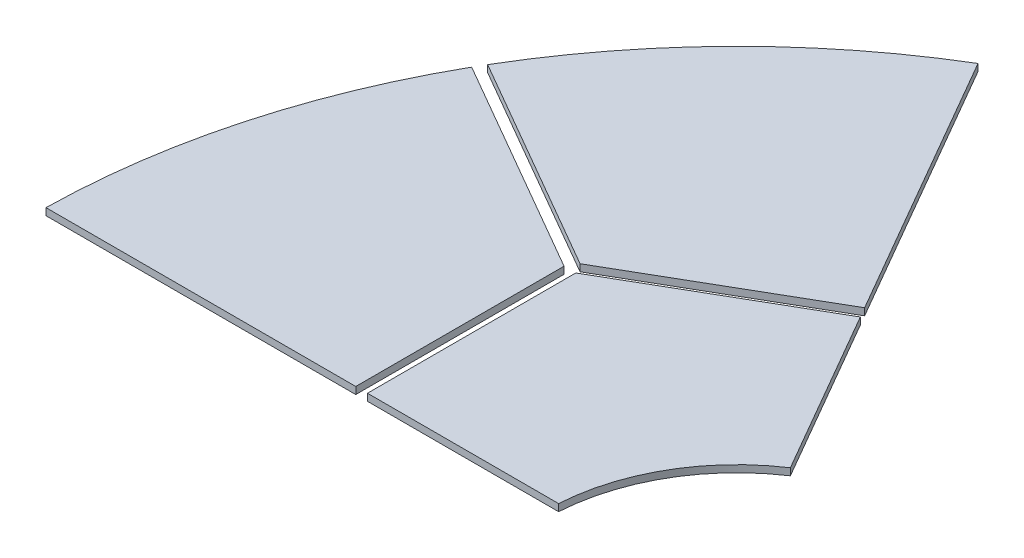
ISO-10303-21;
HEADER;
FILE_DESCRIPTION(('STEP AP214'),'2;1');
FILE_NAME('part.step','',(''),(''),'','','');
FILE_SCHEMA(('AUTOMOTIVE_DESIGN { 1 0 10303 214 1 1 1 1 }'));
ENDSEC;
DATA;
#1=APPLICATION_CONTEXT('core data for automotive mechanical design processes');
#2=APPLICATION_PROTOCOL_DEFINITION('international standard','automotive_design',2000,#1);
#3=PRODUCT_CONTEXT('',#1,'mechanical');
#4=PRODUCT('Part','Part','',(#3));
#5=PRODUCT_RELATED_PRODUCT_CATEGORY('part','',(#4));
#6=PRODUCT_DEFINITION_FORMATION('','',#4);
#7=PRODUCT_DEFINITION_CONTEXT('part definition',#1,'design');
#8=PRODUCT_DEFINITION('design','',#6,#7);
#9=PRODUCT_DEFINITION_SHAPE('','',#8);
#10=(LENGTH_UNIT() NAMED_UNIT(*) SI_UNIT(.MILLI.,.METRE.));
#11=(NAMED_UNIT(*) PLANE_ANGLE_UNIT() SI_UNIT($,.RADIAN.));
#12=(NAMED_UNIT(*) SI_UNIT($,.STERADIAN.) SOLID_ANGLE_UNIT());
#13=UNCERTAINTY_MEASURE_WITH_UNIT(LENGTH_MEASURE(1.E-05),#10,'distance_accuracy_value','');
#14=(GEOMETRIC_REPRESENTATION_CONTEXT(3) GLOBAL_UNCERTAINTY_ASSIGNED_CONTEXT((#13)) GLOBAL_UNIT_ASSIGNED_CONTEXT((#10,
#11,#12)) REPRESENTATION_CONTEXT('',''));
#15=CARTESIAN_POINT('',(0.,0.,0.));
#16=DIRECTION('',(0.,0.,1.));
#17=DIRECTION('',(1.,0.,0.));
#18=AXIS2_PLACEMENT_3D('',#15,#16,#17);
#19=CARTESIAN_POINT('',(0.,6.,0.));
#20=DIRECTION('',(0.,-1.,0.));
#21=DIRECTION('',(0.,0.,-1.));
#22=AXIS2_PLACEMENT_3D('',#19,#20,#21);
#23=CYLINDRICAL_SURFACE('',#22,162.4);
#24=CARTESIAN_POINT('',(0.,0.,0.));
#25=DIRECTION('',(0.,1.,0.));
#26=DIRECTION('',(0.,0.,1.));
#27=AXIS2_PLACEMENT_3D('',#24,#25,#26);
#28=CIRCLE('',#27,162.4);
#29=CARTESIAN_POINT('',(-89.7061669514525,0.,-135.37563891217));
#30=VERTEX_POINT('',#29);
#31=CARTESIAN_POINT('',(-162.091825827214,0.,-10.));
#32=VERTEX_POINT('',#31);
#33=EDGE_CURVE('E179',#30,#32,#28,.T.);
#34=ORIENTED_EDGE('',*,*,#33,.F.);
#35=DIRECTION('',(0.,-1.,0.));
#36=VECTOR('',#35,1.);
#37=CARTESIAN_POINT('',(-89.7061669514525,6.,-135.37563891217));
#38=LINE('',#37,#36);
#39=CARTESIAN_POINT('',(-89.7061669514525,6.,-135.37563891217));
#40=VERTEX_POINT('',#39);
#41=EDGE_CURVE('E13',#40,#30,#38,.T.);
#42=ORIENTED_EDGE('',*,*,#41,.F.);
#43=CARTESIAN_POINT('',(0.,6.,0.));
#44=DIRECTION('',(0.,1.,0.));
#45=DIRECTION('',(0.,0.,1.));
#46=AXIS2_PLACEMENT_3D('',#43,#44,#45);
#47=CIRCLE('',#46,162.4);
#48=CARTESIAN_POINT('',(-162.091825827214,6.,-10.));
#49=VERTEX_POINT('',#48);
#50=EDGE_CURVE('E190',#40,#49,#47,.T.);
#51=ORIENTED_EDGE('',*,*,#50,.T.);
#52=DIRECTION('',(0.,-1.,0.));
#53=VECTOR('',#52,1.);
#54=CARTESIAN_POINT('',(-162.091825827214,6.,-10.));
#55=LINE('',#54,#53);
#56=EDGE_CURVE('E122',#49,#32,#55,.T.);
#57=ORIENTED_EDGE('',*,*,#56,.T.);
#58=EDGE_LOOP('',(#34,#42,#51,#57));
#59=FACE_BOUND('',#58,.T.);
#60=ADVANCED_FACE('F106',(#59),#23,.F.);
#61=CARTESIAN_POINT('',(-8.66025403784625,6.,5.000000000001));
#62=DIRECTION('',(-0.866025403784442,0.,0.499999999999994));
#63=DIRECTION('',(0.499999999999994,0.,0.866025403784442));
#64=AXIS2_PLACEMENT_3D('',#61,#62,#63);
#65=PLANE('',#64);
#66=DIRECTION('',(-0.499999999999994,0.,-0.866025403784442));
#67=VECTOR('',#66,1.);
#68=CARTESIAN_POINT('',(-8.66025403784625,0.,5.000000000001));
#69=LINE('',#68,#67);
#70=CARTESIAN_POINT('',(-171.260254037845,0.,-276.6314613107));
#71=VERTEX_POINT('',#70);
#72=EDGE_CURVE('E181',#30,#71,#69,.T.);
#73=ORIENTED_EDGE('',*,*,#72,.T.);
#74=DIRECTION('',(0.,-1.,0.));
#75=VECTOR('',#74,1.);
#76=CARTESIAN_POINT('',(-171.260254037845,6.,-276.6314613107));
#77=LINE('',#76,#75);
#78=CARTESIAN_POINT('',(-171.260254037845,6.,-276.6314613107));
#79=VERTEX_POINT('',#78);
#80=EDGE_CURVE('E114',#79,#71,#77,.T.);
#81=ORIENTED_EDGE('',*,*,#80,.F.);
#82=DIRECTION('',(-0.499999999999994,0.,-0.866025403784442));
#83=VECTOR('',#82,1.);
#84=CARTESIAN_POINT('',(-8.66025403784625,6.,5.000000000001));
#85=LINE('',#84,#83);
#86=EDGE_CURVE('E170',#40,#79,#85,.T.);
#87=ORIENTED_EDGE('',*,*,#86,.F.);
#88=ORIENTED_EDGE('',*,*,#41,.T.);
#89=EDGE_LOOP('',(#73,#81,#87,#88));
#90=FACE_BOUND('',#89,.T.);
#91=ADVANCED_FACE('F194',(#90),#65,.F.);
#92=CARTESIAN_POINT('',(-162.6,6.,-281.6314613107));
#93=DIRECTION('',(-0.5,0.,-0.866025403784438));
#94=DIRECTION('',(-0.866025403784439,0.,0.5));
#95=AXIS2_PLACEMENT_3D('',#92,#93,#94);
#96=PLANE('',#95);
#97=DIRECTION('',(0.866025403784439,0.,-0.5));
#98=VECTOR('',#97,1.);
#99=CARTESIAN_POINT('',(-162.6,0.,-281.6314613107));
#100=LINE('',#99,#98);
#101=CARTESIAN_POINT('',(-325.2,0.,-187.754307540467));
#102=VERTEX_POINT('',#101);
#103=EDGE_CURVE('E159',#102,#71,#100,.T.);
#104=ORIENTED_EDGE('',*,*,#103,.F.);
#105=DIRECTION('',(0.,-1.,0.));
#106=VECTOR('',#105,1.);
#107=CARTESIAN_POINT('',(-325.2,6.,-187.754307540467));
#108=LINE('',#107,#106);
#109=CARTESIAN_POINT('',(-325.2,6.,-187.754307540467));
#110=VERTEX_POINT('',#109);
#111=EDGE_CURVE('E154',#110,#102,#108,.T.);
#112=ORIENTED_EDGE('',*,*,#111,.F.);
#113=DIRECTION('',(0.866025403784439,0.,-0.5));
#114=VECTOR('',#113,1.);
#115=CARTESIAN_POINT('',(-162.6,6.,-281.6314613107));
#116=LINE('',#115,#114);
#117=EDGE_CURVE('E157',#110,#79,#116,.T.);
#118=ORIENTED_EDGE('',*,*,#117,.T.);
#119=ORIENTED_EDGE('',*,*,#80,.T.);
#120=EDGE_LOOP('',(#104,#112,#118,#119));
#121=FACE_BOUND('',#120,.T.);
#122=ADVANCED_FACE('F156',(#121),#96,.T.);
#123=CARTESIAN_POINT('',(-325.2,6.,0.));
#124=DIRECTION('',(-1.,0.,0.));
#125=DIRECTION('',(0.,0.,1.));
#126=AXIS2_PLACEMENT_3D('',#123,#124,#125);
#127=PLANE('',#126);
#128=DIRECTION('',(0.,0.,-1.));
#129=VECTOR('',#128,1.);
#130=CARTESIAN_POINT('',(-325.2,0.,0.));
#131=LINE('',#130,#129);
#132=CARTESIAN_POINT('',(-325.2,0.,-10.));
#133=VERTEX_POINT('',#132);
#134=EDGE_CURVE('E185',#133,#102,#131,.T.);
#135=ORIENTED_EDGE('',*,*,#134,.F.);
#136=DIRECTION('',(0.,-1.,0.));
#137=VECTOR('',#136,1.);
#138=CARTESIAN_POINT('',(-325.2,6.,-10.));
#139=LINE('',#138,#137);
#140=CARTESIAN_POINT('',(-325.2,6.,-10.));
#141=VERTEX_POINT('',#140);
#142=EDGE_CURVE('E138',#141,#133,#139,.T.);
#143=ORIENTED_EDGE('',*,*,#142,.F.);
#144=DIRECTION('',(0.,0.,-1.));
#145=VECTOR('',#144,1.);
#146=CARTESIAN_POINT('',(-325.2,6.,0.));
#147=LINE('',#146,#145);
#148=EDGE_CURVE('E169',#141,#110,#147,.T.);
#149=ORIENTED_EDGE('',*,*,#148,.T.);
#150=ORIENTED_EDGE('',*,*,#111,.T.);
#151=EDGE_LOOP('',(#135,#143,#149,#150));
#152=FACE_BOUND('',#151,.T.);
#153=ADVANCED_FACE('F173',(#152),#127,.T.);
#154=CARTESIAN_POINT('',(0.,6.,-10.));
#155=DIRECTION('',(0.,0.,1.));
#156=DIRECTION('',(1.,0.,0.));
#157=AXIS2_PLACEMENT_3D('',#154,#155,#156);
#158=PLANE('',#157);
#159=DIRECTION('',(-1.,0.,0.));
#160=VECTOR('',#159,1.);
#161=CARTESIAN_POINT('',(0.,0.,-10.));
#162=LINE('',#161,#160);
#163=EDGE_CURVE('E187',#32,#133,#162,.T.);
#164=ORIENTED_EDGE('',*,*,#163,.F.);
#165=ORIENTED_EDGE('',*,*,#56,.F.);
#166=DIRECTION('',(-1.,0.,0.));
#167=VECTOR('',#166,1.);
#168=CARTESIAN_POINT('',(0.,6.,-10.));
#169=LINE('',#168,#167);
#170=EDGE_CURVE('E174',#49,#141,#169,.T.);
#171=ORIENTED_EDGE('',*,*,#170,.T.);
#172=ORIENTED_EDGE('',*,*,#142,.T.);
#173=EDGE_LOOP('',(#164,#165,#171,#172));
#174=FACE_BOUND('',#173,.T.);
#175=ADVANCED_FACE('F197',(#174),#158,.T.);
#176=CARTESIAN_POINT('',(0.,6.,0.));
#177=DIRECTION('',(0.,1.,0.));
#178=DIRECTION('',(0.,0.,1.));
#179=AXIS2_PLACEMENT_3D('',#176,#177,#178);
#180=PLANE('',#179);
#181=ORIENTED_EDGE('',*,*,#50,.F.);
#182=ORIENTED_EDGE('',*,*,#86,.T.);
#183=ORIENTED_EDGE('',*,*,#117,.F.);
#184=ORIENTED_EDGE('',*,*,#148,.F.);
#185=ORIENTED_EDGE('',*,*,#170,.F.);
#186=EDGE_LOOP('',(#181,#182,#183,#184,#185));
#187=FACE_BOUND('',#186,.T.);
#188=ADVANCED_FACE('F167',(#187),#180,.T.);
#189=CARTESIAN_POINT('',(0.,0.,0.));
#190=DIRECTION('',(0.,1.,0.));
#191=DIRECTION('',(0.,0.,1.));
#192=AXIS2_PLACEMENT_3D('',#189,#190,#191);
#193=PLANE('',#192);
#194=ORIENTED_EDGE('',*,*,#33,.T.);
#195=ORIENTED_EDGE('',*,*,#163,.T.);
#196=ORIENTED_EDGE('',*,*,#134,.T.);
#197=ORIENTED_EDGE('',*,*,#103,.T.);
#198=ORIENTED_EDGE('',*,*,#72,.F.);
#199=EDGE_LOOP('',(#194,#195,#196,#197,#198));
#200=FACE_BOUND('',#199,.T.);
#201=ADVANCED_FACE('F196',(#200),#193,.F.);
#202=CLOSED_SHELL('',(#60,#91,#122,#153,#175,#188,#201));
#203=MANIFOLD_SOLID_BREP('B2',#202);
#204=CARTESIAN_POINT('',(1.11022302462516E-13,6.,0.));
#205=DIRECTION('',(0.,-1.,0.));
#206=DIRECTION('',(0.,0.,-1.));
#207=AXIS2_PLACEMENT_3D('',#204,#205,#206);
#208=CYLINDRICAL_SURFACE('',#207,599.6);
#209=CARTESIAN_POINT('',(1.11022302462516E-13,0.,0.));
#210=DIRECTION('',(0.,1.,0.));
#211=DIRECTION('',(0.,0.,1.));
#212=AXIS2_PLACEMENT_3D('',#209,#210,#211);
#213=CIRCLE('',#212,599.6);
#214=CARTESIAN_POINT('',(-516.750777563212,0.,-304.119703221965));
#215=VERTEX_POINT('',#214);
#216=CARTESIAN_POINT('',(-308.418556675151,0.,-514.196610158426));
#217=VERTEX_POINT('',#216);
#218=EDGE_CURVE('E362',#215,#217,#213,.F.);
#219=ORIENTED_EDGE('',*,*,#218,.F.);
#220=DIRECTION('',(0.,-1.,0.));
#221=VECTOR('',#220,1.);
#222=CARTESIAN_POINT('',(-516.750777563212,6.,-304.119703221965));
#223=LINE('',#222,#221);
#224=CARTESIAN_POINT('',(-516.750777563212,6.,-304.119703221965));
#225=VERTEX_POINT('',#224);
#226=EDGE_CURVE('E104',#225,#215,#223,.T.);
#227=ORIENTED_EDGE('',*,*,#226,.F.);
#228=CARTESIAN_POINT('',(1.11022302462516E-13,6.,0.));
#229=DIRECTION('',(0.,1.,0.));
#230=DIRECTION('',(0.,0.,1.));
#231=AXIS2_PLACEMENT_3D('',#228,#229,#230);
#232=CIRCLE('',#231,599.6);
#233=CARTESIAN_POINT('',(-308.418556675151,6.,-514.196610158426));
#234=VERTEX_POINT('',#233);
#235=EDGE_CURVE('E353',#225,#234,#232,.F.);
#236=ORIENTED_EDGE('',*,*,#235,.T.);
#237=DIRECTION('',(0.,-1.,0.));
#238=VECTOR('',#237,1.);
#239=CARTESIAN_POINT('',(-308.418556675151,6.,-514.196610158426));
#240=LINE('',#239,#238);
#241=EDGE_CURVE('E332',#234,#217,#240,.T.);
#242=ORIENTED_EDGE('',*,*,#241,.T.);
#243=EDGE_LOOP('',(#219,#227,#236,#242));
#244=FACE_BOUND('',#243,.T.);
#245=ADVANCED_FACE('F293',(#244),#208,.T.);
#246=CARTESIAN_POINT('',(2.49999999999996,6.,-4.33012701892212));
#247=DIRECTION('',(-0.5,0.,0.866025403784438));
#248=DIRECTION('',(0.866025403784439,0.,0.5));
#249=AXIS2_PLACEMENT_3D('',#246,#247,#248);
#250=PLANE('',#249);
#251=DIRECTION('',(-0.866025403784439,0.,-0.5));
#252=VECTOR('',#251,1.);
#253=CARTESIAN_POINT('',(2.49999999999996,0.,-4.33012701892212));
#254=LINE('',#253,#252);
#255=CARTESIAN_POINT('',(-330.200000000001,0.,-196.414561578311));
#256=VERTEX_POINT('',#255);
#257=EDGE_CURVE('E345',#256,#215,#254,.T.);
#258=ORIENTED_EDGE('',*,*,#257,.F.);
#259=DIRECTION('',(0.,-1.,0.));
#260=VECTOR('',#259,1.);
#261=CARTESIAN_POINT('',(-330.200000000001,6.,-196.414561578311));
#262=LINE('',#261,#260);
#263=CARTESIAN_POINT('',(-330.200000000001,6.,-196.414561578311));
#264=VERTEX_POINT('',#263);
#265=EDGE_CURVE('E302',#264,#256,#262,.T.);
#266=ORIENTED_EDGE('',*,*,#265,.F.);
#267=DIRECTION('',(-0.866025403784439,0.,-0.5));
#268=VECTOR('',#267,1.);
#269=CARTESIAN_POINT('',(2.49999999999996,6.,-4.33012701892212));
#270=LINE('',#269,#268);
#271=EDGE_CURVE('E343',#264,#225,#270,.T.);
#272=ORIENTED_EDGE('',*,*,#271,.T.);
#273=ORIENTED_EDGE('',*,*,#226,.T.);
#274=EDGE_LOOP('',(#258,#266,#272,#273));
#275=FACE_BOUND('',#274,.T.);
#276=ADVANCED_FACE('F341',(#275),#250,.T.);
#277=CARTESIAN_POINT('',(-167.6,6.,-290.291715348544));
#278=DIRECTION('',(-0.5,0.,-0.866025403784438));
#279=DIRECTION('',(-0.866025403784439,0.,0.5));
#280=AXIS2_PLACEMENT_3D('',#277,#278,#279);
#281=PLANE('',#280);
#282=DIRECTION('',(0.866025403784438,0.,-0.5));
#283=VECTOR('',#282,1.);
#284=CARTESIAN_POINT('',(-167.6,0.,-290.291715348544));
#285=LINE('',#284,#283);
#286=CARTESIAN_POINT('',(-176.260254037845,0.,-285.291715348544));
#287=VERTEX_POINT('',#286);
#288=EDGE_CURVE('E325',#256,#287,#285,.T.);
#289=ORIENTED_EDGE('',*,*,#288,.T.);
#290=DIRECTION('',(0.,-1.,0.));
#291=VECTOR('',#290,1.);
#292=CARTESIAN_POINT('',(-176.260254037845,6.,-285.291715348544));
#293=LINE('',#292,#291);
#294=CARTESIAN_POINT('',(-176.260254037845,6.,-285.291715348544));
#295=VERTEX_POINT('',#294);
#296=EDGE_CURVE('E347',#295,#287,#293,.T.);
#297=ORIENTED_EDGE('',*,*,#296,.F.);
#298=DIRECTION('',(0.866025403784438,0.,-0.5));
#299=VECTOR('',#298,1.);
#300=CARTESIAN_POINT('',(-167.6,6.,-290.291715348544));
#301=LINE('',#300,#299);
#302=EDGE_CURVE('E348',#264,#295,#301,.T.);
#303=ORIENTED_EDGE('',*,*,#302,.F.);
#304=ORIENTED_EDGE('',*,*,#265,.T.);
#305=EDGE_LOOP('',(#289,#297,#303,#304));
#306=FACE_BOUND('',#305,.T.);
#307=ADVANCED_FACE('F349',(#306),#281,.F.);
#308=CARTESIAN_POINT('',(-8.6602540378462,6.,5.00000000000098));
#309=DIRECTION('',(-0.866025403784442,0.,0.499999999999995));
#310=DIRECTION('',(0.499999999999995,0.,0.866025403784442));
#311=AXIS2_PLACEMENT_3D('',#308,#309,#310);
#312=PLANE('',#311);
#313=DIRECTION('',(-0.499999999999995,0.,-0.866025403784442));
#314=VECTOR('',#313,1.);
#315=CARTESIAN_POINT('',(-8.6602540378462,0.,5.00000000000098));
#316=LINE('',#315,#314);
#317=EDGE_CURVE('E357',#287,#217,#316,.T.);
#318=ORIENTED_EDGE('',*,*,#317,.T.);
#319=ORIENTED_EDGE('',*,*,#241,.F.);
#320=DIRECTION('',(-0.499999999999995,0.,-0.866025403784442));
#321=VECTOR('',#320,1.);
#322=CARTESIAN_POINT('',(-8.6602540378462,6.,5.00000000000098));
#323=LINE('',#322,#321);
#324=EDGE_CURVE('E310',#295,#234,#323,.T.);
#325=ORIENTED_EDGE('',*,*,#324,.F.);
#326=ORIENTED_EDGE('',*,*,#296,.T.);
#327=EDGE_LOOP('',(#318,#319,#325,#326));
#328=FACE_BOUND('',#327,.T.);
#329=ADVANCED_FACE('F377',(#328),#312,.F.);
#330=CARTESIAN_POINT('',(0.,6.,0.));
#331=DIRECTION('',(0.,1.,0.));
#332=DIRECTION('',(0.,0.,1.));
#333=AXIS2_PLACEMENT_3D('',#330,#331,#332);
#334=PLANE('',#333);
#335=ORIENTED_EDGE('',*,*,#235,.F.);
#336=ORIENTED_EDGE('',*,*,#271,.F.);
#337=ORIENTED_EDGE('',*,*,#302,.T.);
#338=ORIENTED_EDGE('',*,*,#324,.T.);
#339=EDGE_LOOP('',(#335,#336,#337,#338));
#340=FACE_BOUND('',#339,.T.);
#341=ADVANCED_FACE('F352',(#340),#334,.T.);
#342=CARTESIAN_POINT('',(0.,0.,0.));
#343=DIRECTION('',(0.,1.,0.));
#344=DIRECTION('',(0.,0.,1.));
#345=AXIS2_PLACEMENT_3D('',#342,#343,#344);
#346=PLANE('',#345);
#347=ORIENTED_EDGE('',*,*,#218,.T.);
#348=ORIENTED_EDGE('',*,*,#317,.F.);
#349=ORIENTED_EDGE('',*,*,#288,.F.);
#350=ORIENTED_EDGE('',*,*,#257,.T.);
#351=EDGE_LOOP('',(#347,#348,#349,#350));
#352=FACE_BOUND('',#351,.T.);
#353=ADVANCED_FACE('F379',(#352),#346,.F.);
#354=CLOSED_SHELL('',(#245,#276,#307,#329,#341,#353));
#355=MANIFOLD_SOLID_BREP('B7',#354);
#356=CARTESIAN_POINT('',(1.11022302462516E-13,6.,0.));
#357=DIRECTION('',(0.,-1.,0.));
#358=DIRECTION('',(0.,0.,-1.));
#359=AXIS2_PLACEMENT_3D('',#356,#357,#358);
#360=CYLINDRICAL_SURFACE('',#359,599.6);
#361=CARTESIAN_POINT('',(1.11022302462516E-13,0.,0.));
#362=DIRECTION('',(0.,1.,0.));
#363=DIRECTION('',(0.,0.,1.));
#364=AXIS2_PLACEMENT_3D('',#361,#362,#363);
#365=CIRCLE('',#364,599.6);
#366=CARTESIAN_POINT('',(-599.516605274616,0.,-10.));
#367=VERTEX_POINT('',#366);
#368=CARTESIAN_POINT('',(-521.750777563212,0.,-295.459449184121));
#369=VERTEX_POINT('',#368);
#370=EDGE_CURVE('E515',#367,#369,#365,.F.);
#371=ORIENTED_EDGE('',*,*,#370,.F.);
#372=DIRECTION('',(0.,-1.,0.));
#373=VECTOR('',#372,1.);
#374=CARTESIAN_POINT('',(-599.516605274616,6.,-10.));
#375=LINE('',#374,#373);
#376=CARTESIAN_POINT('',(-599.516605274616,6.,-10.));
#377=VERTEX_POINT('',#376);
#378=EDGE_CURVE('E291',#377,#367,#375,.T.);
#379=ORIENTED_EDGE('',*,*,#378,.F.);
#380=CARTESIAN_POINT('',(1.11022302462516E-13,6.,0.));
#381=DIRECTION('',(0.,1.,0.));
#382=DIRECTION('',(0.,0.,1.));
#383=AXIS2_PLACEMENT_3D('',#380,#381,#382);
#384=CIRCLE('',#383,599.6);
#385=CARTESIAN_POINT('',(-521.750777563212,6.,-295.459449184121));
#386=VERTEX_POINT('',#385);
#387=EDGE_CURVE('E509',#377,#386,#384,.F.);
#388=ORIENTED_EDGE('',*,*,#387,.T.);
#389=DIRECTION('',(0.,-1.,0.));
#390=VECTOR('',#389,1.);
#391=CARTESIAN_POINT('',(-521.750777563212,6.,-295.459449184121));
#392=LINE('',#391,#390);
#393=EDGE_CURVE('E490',#386,#369,#392,.T.);
#394=ORIENTED_EDGE('',*,*,#393,.T.);
#395=EDGE_LOOP('',(#371,#379,#388,#394));
#396=FACE_BOUND('',#395,.T.);
#397=ADVANCED_FACE('F452',(#396),#360,.T.);
#398=CARTESIAN_POINT('',(0.,6.,-10.));
#399=DIRECTION('',(0.,0.,1.));
#400=DIRECTION('',(1.,0.,0.));
#401=AXIS2_PLACEMENT_3D('',#398,#399,#400);
#402=PLANE('',#401);
#403=DIRECTION('',(-1.,0.,0.));
#404=VECTOR('',#403,1.);
#405=CARTESIAN_POINT('',(0.,0.,-10.));
#406=LINE('',#405,#404);
#407=CARTESIAN_POINT('',(-335.2,0.,-10.));
#408=VERTEX_POINT('',#407);
#409=EDGE_CURVE('E503',#408,#367,#406,.T.);
#410=ORIENTED_EDGE('',*,*,#409,.F.);
#411=DIRECTION('',(0.,-1.,0.));
#412=VECTOR('',#411,1.);
#413=CARTESIAN_POINT('',(-335.2,6.,-10.));
#414=LINE('',#413,#412);
#415=CARTESIAN_POINT('',(-335.2,6.,-10.));
#416=VERTEX_POINT('',#415);
#417=EDGE_CURVE('E460',#416,#408,#414,.T.);
#418=ORIENTED_EDGE('',*,*,#417,.F.);
#419=DIRECTION('',(-1.,0.,0.));
#420=VECTOR('',#419,1.);
#421=CARTESIAN_POINT('',(0.,6.,-10.));
#422=LINE('',#421,#420);
#423=EDGE_CURVE('E501',#416,#377,#422,.T.);
#424=ORIENTED_EDGE('',*,*,#423,.T.);
#425=ORIENTED_EDGE('',*,*,#378,.T.);
#426=EDGE_LOOP('',(#410,#418,#424,#425));
#427=FACE_BOUND('',#426,.T.);
#428=ADVANCED_FACE('F499',(#427),#402,.T.);
#429=CARTESIAN_POINT('',(-335.2,6.,0.));
#430=DIRECTION('',(-1.,0.,0.));
#431=DIRECTION('',(0.,0.,1.));
#432=AXIS2_PLACEMENT_3D('',#429,#430,#431);
#433=PLANE('',#432);
#434=DIRECTION('',(0.,0.,-1.));
#435=VECTOR('',#434,1.);
#436=CARTESIAN_POINT('',(-335.2,0.,0.));
#437=LINE('',#436,#435);
#438=CARTESIAN_POINT('',(-335.2,0.,-187.754307540466));
#439=VERTEX_POINT('',#438);
#440=EDGE_CURVE('E483',#408,#439,#437,.T.);
#441=ORIENTED_EDGE('',*,*,#440,.T.);
#442=DIRECTION('',(0.,-1.,0.));
#443=VECTOR('',#442,1.);
#444=CARTESIAN_POINT('',(-335.2,6.,-187.754307540466));
#445=LINE('',#444,#443);
#446=CARTESIAN_POINT('',(-335.2,6.,-187.754307540466));
#447=VERTEX_POINT('',#446);
#448=EDGE_CURVE('E504',#447,#439,#445,.T.);
#449=ORIENTED_EDGE('',*,*,#448,.F.);
#450=DIRECTION('',(0.,0.,-1.));
#451=VECTOR('',#450,1.);
#452=CARTESIAN_POINT('',(-335.2,6.,0.));
#453=LINE('',#452,#451);
#454=EDGE_CURVE('E505',#416,#447,#453,.T.);
#455=ORIENTED_EDGE('',*,*,#454,.F.);
#456=ORIENTED_EDGE('',*,*,#417,.T.);
#457=EDGE_LOOP('',(#441,#449,#455,#456));
#458=FACE_BOUND('',#457,.T.);
#459=ADVANCED_FACE('F506',(#458),#433,.F.);
#460=CARTESIAN_POINT('',(-2.49999999999999,6.,4.33012701892217));
#461=DIRECTION('',(-0.5,0.,0.866025403784439));
#462=DIRECTION('',(0.866025403784439,0.,0.5));
#463=AXIS2_PLACEMENT_3D('',#460,#461,#462);
#464=PLANE('',#463);
#465=DIRECTION('',(-0.866025403784439,0.,-0.5));
#466=VECTOR('',#465,1.);
#467=CARTESIAN_POINT('',(-2.49999999999999,0.,4.33012701892217));
#468=LINE('',#467,#466);
#469=EDGE_CURVE('E511',#439,#369,#468,.T.);
#470=ORIENTED_EDGE('',*,*,#469,.T.);
#471=ORIENTED_EDGE('',*,*,#393,.F.);
#472=DIRECTION('',(-0.866025403784439,0.,-0.5));
#473=VECTOR('',#472,1.);
#474=CARTESIAN_POINT('',(-2.49999999999999,6.,4.33012701892217));
#475=LINE('',#474,#473);
#476=EDGE_CURVE('E468',#447,#386,#475,.T.);
#477=ORIENTED_EDGE('',*,*,#476,.F.);
#478=ORIENTED_EDGE('',*,*,#448,.T.);
#479=EDGE_LOOP('',(#470,#471,#477,#478));
#480=FACE_BOUND('',#479,.T.);
#481=ADVANCED_FACE('F524',(#480),#464,.F.);
#482=CARTESIAN_POINT('',(0.,6.,0.));
#483=DIRECTION('',(0.,1.,0.));
#484=DIRECTION('',(0.,0.,1.));
#485=AXIS2_PLACEMENT_3D('',#482,#483,#484);
#486=PLANE('',#485);
#487=ORIENTED_EDGE('',*,*,#387,.F.);
#488=ORIENTED_EDGE('',*,*,#423,.F.);
#489=ORIENTED_EDGE('',*,*,#454,.T.);
#490=ORIENTED_EDGE('',*,*,#476,.T.);
#491=EDGE_LOOP('',(#487,#488,#489,#490));
#492=FACE_BOUND('',#491,.T.);
#493=ADVANCED_FACE('F508',(#492),#486,.T.);
#494=CARTESIAN_POINT('',(0.,0.,0.));
#495=DIRECTION('',(0.,1.,0.));
#496=DIRECTION('',(0.,0.,1.));
#497=AXIS2_PLACEMENT_3D('',#494,#495,#496);
#498=PLANE('',#497);
#499=ORIENTED_EDGE('',*,*,#370,.T.);
#500=ORIENTED_EDGE('',*,*,#469,.F.);
#501=ORIENTED_EDGE('',*,*,#440,.F.);
#502=ORIENTED_EDGE('',*,*,#409,.T.);
#503=EDGE_LOOP('',(#499,#500,#501,#502));
#504=FACE_BOUND('',#503,.T.);
#505=ADVANCED_FACE('F526',(#504),#498,.F.);
#506=CLOSED_SHELL('',(#397,#428,#459,#481,#493,#505));
#507=MANIFOLD_SOLID_BREP('B98',#506);
#508=ADVANCED_BREP_SHAPE_REPRESENTATION('',(#18,#203,#355,#507),#14);
#509=SHAPE_DEFINITION_REPRESENTATION(#9,#508);
ENDSEC;
END-ISO-10303-21;
